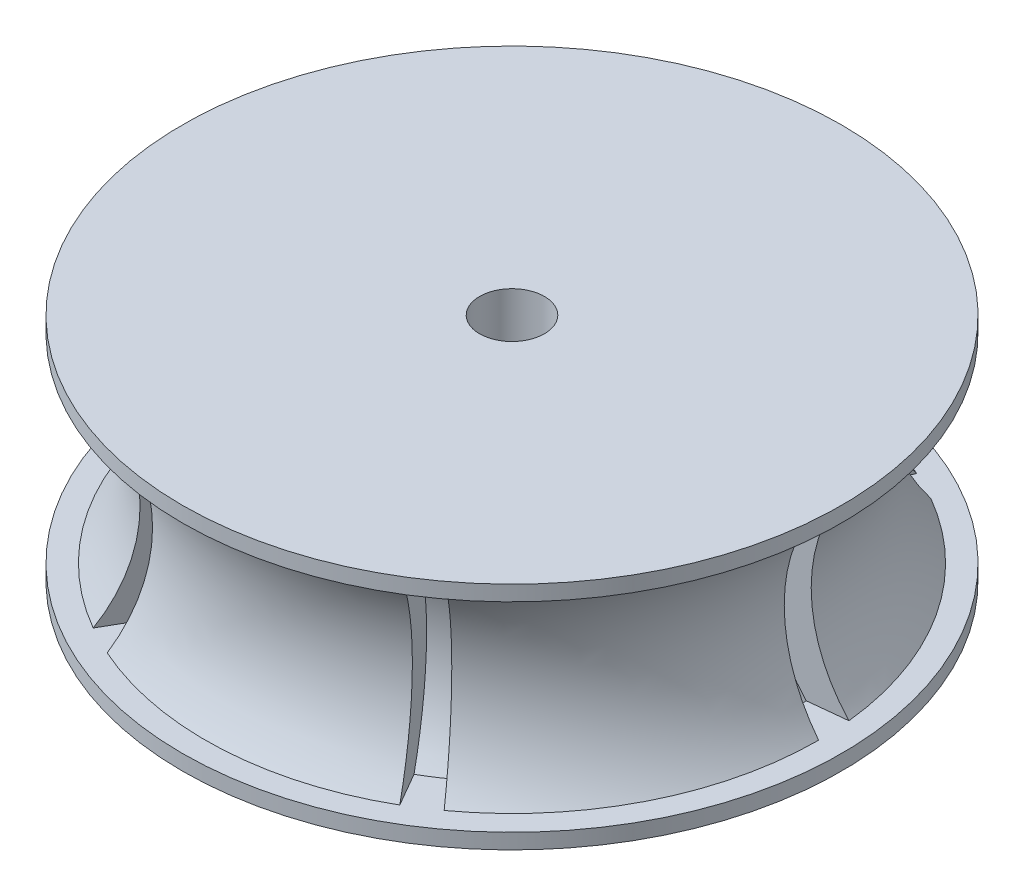
ISO-10303-21;
HEADER;
FILE_DESCRIPTION(('STEP AP214'),'2;1');
FILE_NAME('part.step','',(''),(''),'','','');
FILE_SCHEMA(('AUTOMOTIVE_DESIGN { 1 0 10303 214 1 1 1 1 }'));
ENDSEC;
DATA;
#1=APPLICATION_CONTEXT('core data for automotive mechanical design processes');
#2=APPLICATION_PROTOCOL_DEFINITION('international standard','automotive_design',2000,#1);
#3=PRODUCT_CONTEXT('',#1,'mechanical');
#4=PRODUCT('Part','Part','',(#3));
#5=PRODUCT_RELATED_PRODUCT_CATEGORY('part','',(#4));
#6=PRODUCT_DEFINITION_FORMATION('','',#4);
#7=PRODUCT_DEFINITION_CONTEXT('part definition',#1,'design');
#8=PRODUCT_DEFINITION('design','',#6,#7);
#9=PRODUCT_DEFINITION_SHAPE('','',#8);
#10=(LENGTH_UNIT() NAMED_UNIT(*) SI_UNIT(.MILLI.,.METRE.));
#11=(NAMED_UNIT(*) PLANE_ANGLE_UNIT() SI_UNIT($,.RADIAN.));
#12=(NAMED_UNIT(*) SI_UNIT($,.STERADIAN.) SOLID_ANGLE_UNIT());
#13=UNCERTAINTY_MEASURE_WITH_UNIT(LENGTH_MEASURE(1.E-05),#10,'distance_accuracy_value','');
#14=(GEOMETRIC_REPRESENTATION_CONTEXT(3) GLOBAL_UNCERTAINTY_ASSIGNED_CONTEXT((#13)) GLOBAL_UNIT_ASSIGNED_CONTEXT((#10,
#11,#12)) REPRESENTATION_CONTEXT('',''));
#15=CARTESIAN_POINT('',(0.,0.,0.));
#16=DIRECTION('',(0.,0.,1.));
#17=DIRECTION('',(1.,0.,0.));
#18=AXIS2_PLACEMENT_3D('',#15,#16,#17);
#19=CARTESIAN_POINT('',(0.,0.,0.));
#20=DIRECTION('',(0.,1.,0.));
#21=DIRECTION('',(0.,0.,1.));
#22=AXIS2_PLACEMENT_3D('',#19,#20,#21);
#23=TOROIDAL_SURFACE('',#22,85.09,31.75);
#24=CARTESIAN_POINT('',(0.,-19.55,0.));
#25=DIRECTION('',(0.,1.,0.));
#26=DIRECTION('',(0.,0.,1.));
#27=AXIS2_PLACEMENT_3D('',#24,#25,#26);
#28=CIRCLE('',#27,60.0728059127327);
#29=CARTESIAN_POINT('',(24.4338114170885,-19.55,-54.8792389694228));
#30=VERTEX_POINT('',#29);
#31=CARTESIAN_POINT('',(-30.036402956367,-19.55,-52.0245759970382));
#32=VERTEX_POINT('',#31);
#33=EDGE_CURVE('E447',#30,#32,#28,.T.);
#34=ORIENTED_EDGE('',*,*,#33,.T.);
#35=CARTESIAN_POINT('',(-42.5450000000009,0.,-73.6901016080174));
#36=DIRECTION('',(0.866025403784433,0.,-0.50000000000001));
#37=DIRECTION('',(0.50000000000001,0.,0.866025403784433));
#38=AXIS2_PLACEMENT_3D('',#35,#36,#37);
#39=CIRCLE('',#38,31.75);
#40=CARTESIAN_POINT('',(-30.036402956367,19.55,-52.0245759970382));
#41=VERTEX_POINT('',#40);
#42=EDGE_CURVE('E220',#41,#32,#39,.T.);
#43=ORIENTED_EDGE('',*,*,#42,.F.);
#44=CARTESIAN_POINT('',(0.,19.55,0.));
#45=DIRECTION('',(0.,1.,0.));
#46=DIRECTION('',(0.,0.,1.));
#47=AXIS2_PLACEMENT_3D('',#44,#45,#46);
#48=CIRCLE('',#47,60.0728059127327);
#49=CARTESIAN_POINT('',(24.4338114170885,19.55,-54.8792389694228));
#50=VERTEX_POINT('',#49);
#51=EDGE_CURVE('E394',#50,#41,#48,.T.);
#52=ORIENTED_EDGE('',*,*,#51,.F.);
#53=CARTESIAN_POINT('',(34.6092209593191,0.,-77.7335829908092));
#54=DIRECTION('',(0.913545457642605,0.,0.406736643075791));
#55=DIRECTION('',(-0.406736643075791,0.,0.913545457642605));
#56=AXIS2_PLACEMENT_3D('',#53,#54,#55);
#57=CIRCLE('',#56,31.75);
#58=EDGE_CURVE('E246',#50,#30,#57,.T.);
#59=ORIENTED_EDGE('',*,*,#58,.T.);
#60=EDGE_LOOP('',(#34,#43,#52,#59));
#61=FACE_BOUND('',#60,.T.);
#62=ADVANCED_FACE('F41',(#61),#23,.F.);
#63=CARTESIAN_POINT('',(59.7437207964214,-19.55,-6.27931808623397));
#64=VERTEX_POINT('',#63);
#65=CARTESIAN_POINT('',(30.0364029563659,-19.55,-52.0245759970389));
#66=VERTEX_POINT('',#65);
#67=EDGE_CURVE('E446',#64,#66,#28,.T.);
#68=ORIENTED_EDGE('',*,*,#67,.T.);
#69=CARTESIAN_POINT('',(42.5449999999993,0.,-73.6901016080183));
#70=DIRECTION('',(0.866025403784443,0.,0.499999999999992));
#71=DIRECTION('',(-0.499999999999992,0.,0.866025403784443));
#72=AXIS2_PLACEMENT_3D('',#69,#70,#71);
#73=CIRCLE('',#72,31.75);
#74=CARTESIAN_POINT('',(30.0364029563659,19.55,-52.0245759970389));
#75=VERTEX_POINT('',#74);
#76=EDGE_CURVE('E211',#75,#66,#73,.T.);
#77=ORIENTED_EDGE('',*,*,#76,.F.);
#78=CARTESIAN_POINT('',(59.7437207964214,19.55,-6.27931808623397));
#79=VERTEX_POINT('',#78);
#80=EDGE_CURVE('E399',#79,#75,#48,.T.);
#81=ORIENTED_EDGE('',*,*,#80,.F.);
#82=CARTESIAN_POINT('',(84.6238680768864,0.,-8.89432693944465));
#83=DIRECTION('',(0.104528463267654,0.,0.994521895368273));
#84=DIRECTION('',(-0.994521895368273,0.,0.104528463267654));
#85=AXIS2_PLACEMENT_3D('',#82,#83,#84);
#86=CIRCLE('',#85,31.75);
#87=EDGE_CURVE('E273',#79,#64,#86,.T.);
#88=ORIENTED_EDGE('',*,*,#87,.T.);
#89=EDGE_LOOP('',(#68,#77,#81,#88));
#90=FACE_BOUND('',#89,.T.);
#91=ADVANCED_FACE('F444',(#90),#23,.F.);
#92=CARTESIAN_POINT('',(35.3099093793326,-19.55,48.5999208831884));
#93=VERTEX_POINT('',#92);
#94=CARTESIAN_POINT('',(60.0728059127327,-19.55,0.));
#95=VERTEX_POINT('',#94);
#96=EDGE_CURVE('E432',#93,#95,#28,.T.);
#97=ORIENTED_EDGE('',*,*,#96,.T.);
#98=CARTESIAN_POINT('',(85.09,0.,0.));
#99=DIRECTION('',(0.,0.,1.));
#100=DIRECTION('',(-1.,0.,0.));
#101=AXIS2_PLACEMENT_3D('',#98,#99,#100);
#102=CIRCLE('',#101,31.75);
#103=CARTESIAN_POINT('',(60.0728059127327,19.55,0.));
#104=VERTEX_POINT('',#103);
#105=EDGE_CURVE('E262',#104,#95,#102,.T.);
#106=ORIENTED_EDGE('',*,*,#105,.F.);
#107=CARTESIAN_POINT('',(35.3099093793326,19.55,48.5999208831884));
#108=VERTEX_POINT('',#107);
#109=EDGE_CURVE('E402',#108,#104,#48,.T.);
#110=ORIENTED_EDGE('',*,*,#109,.F.);
#111=CARTESIAN_POINT('',(50.0146471175669,0.,68.8392560513641));
#112=DIRECTION('',(-0.809016994374945,0.,0.587785252292477));
#113=DIRECTION('',(-0.587785252292477,0.,-0.809016994374945));
#114=AXIS2_PLACEMENT_3D('',#111,#112,#113);
#115=CIRCLE('',#114,31.75);
#116=EDGE_CURVE('E300',#108,#93,#115,.T.);
#117=ORIENTED_EDGE('',*,*,#116,.T.);
#118=EDGE_LOOP('',(#97,#106,#110,#117));
#119=FACE_BOUND('',#118,.T.);
#120=ADVANCED_FACE('F430',(#119),#23,.F.);
#121=CARTESIAN_POINT('',(-24.4338114170889,-19.55,54.8792389694226));
#122=VERTEX_POINT('',#121);
#123=CARTESIAN_POINT('',(30.0364029563666,-19.55,52.0245759970384));
#124=VERTEX_POINT('',#123);
#125=EDGE_CURVE('E382',#122,#124,#28,.T.);
#126=ORIENTED_EDGE('',*,*,#125,.T.);
#127=CARTESIAN_POINT('',(42.5450000000003,0.,73.6901016080177));
#128=DIRECTION('',(-0.866025403784436,0.,0.500000000000004));
#129=DIRECTION('',(-0.500000000000004,0.,-0.866025403784436));
#130=AXIS2_PLACEMENT_3D('',#127,#128,#129);
#131=CIRCLE('',#130,31.75);
#132=CARTESIAN_POINT('',(30.0364029563666,19.55,52.0245759970384));
#133=VERTEX_POINT('',#132);
#134=EDGE_CURVE('E289',#133,#124,#131,.T.);
#135=ORIENTED_EDGE('',*,*,#134,.F.);
#136=CARTESIAN_POINT('',(-24.4338114170889,19.55,54.8792389694226));
#137=VERTEX_POINT('',#136);
#138=EDGE_CURVE('E49',#137,#133,#48,.T.);
#139=ORIENTED_EDGE('',*,*,#138,.F.);
#140=CARTESIAN_POINT('',(-34.6092209593197,0.,77.733582990809));
#141=DIRECTION('',(-0.913545457642602,0.,-0.406736643075798));
#142=DIRECTION('',(0.406736643075798,0.,-0.913545457642602));
#143=AXIS2_PLACEMENT_3D('',#140,#141,#142);
#144=CIRCLE('',#143,31.75);
#145=EDGE_CURVE('E327',#137,#122,#144,.T.);
#146=ORIENTED_EDGE('',*,*,#145,.T.);
#147=EDGE_LOOP('',(#126,#135,#139,#146));
#148=FACE_BOUND('',#147,.T.);
#149=ADVANCED_FACE('F417',(#148),#23,.F.);
#150=CARTESIAN_POINT('',(-59.7437207964214,-19.55,6.27931808623397));
#151=VERTEX_POINT('',#150);
#152=CARTESIAN_POINT('',(-30.0364029563663,-19.55,52.0245759970387));
#153=VERTEX_POINT('',#152);
#154=EDGE_CURVE('E378',#151,#153,#28,.T.);
#155=ORIENTED_EDGE('',*,*,#154,.T.);
#156=CARTESIAN_POINT('',(-42.5449999999998,0.,73.690101608018));
#157=DIRECTION('',(-0.86602540378444,0.,-0.499999999999998));
#158=DIRECTION('',(0.499999999999998,0.,-0.86602540378444));
#159=AXIS2_PLACEMENT_3D('',#156,#157,#158);
#160=CIRCLE('',#159,31.75);
#161=CARTESIAN_POINT('',(-30.0364029563662,19.55,52.0245759970386));
#162=VERTEX_POINT('',#161);
#163=EDGE_CURVE('E316',#162,#153,#160,.T.);
#164=ORIENTED_EDGE('',*,*,#163,.F.);
#165=CARTESIAN_POINT('',(-59.7437207964214,19.55,6.27931808623397));
#166=VERTEX_POINT('',#165);
#167=EDGE_CURVE('E11',#166,#162,#48,.T.);
#168=ORIENTED_EDGE('',*,*,#167,.F.);
#169=CARTESIAN_POINT('',(-84.6238680768864,0.,8.89432693944465));
#170=DIRECTION('',(-0.104528463267654,0.,-0.994521895368273));
#171=DIRECTION('',(0.994521895368273,0.,-0.104528463267654));
#172=AXIS2_PLACEMENT_3D('',#169,#170,#171);
#173=CIRCLE('',#172,31.75);
#174=EDGE_CURVE('E355',#166,#151,#173,.T.);
#175=ORIENTED_EDGE('',*,*,#174,.T.);
#176=EDGE_LOOP('',(#155,#164,#168,#175));
#177=FACE_BOUND('',#176,.T.);
#178=ADVANCED_FACE('F463',(#177),#23,.F.);
#179=CARTESIAN_POINT('',(-50.0146471175674,0.,-68.8392560513637));
#180=DIRECTION('',(0.80901699437494,0.,-0.587785252292483));
#181=DIRECTION('',(0.587785252292483,0.,0.80901699437494));
#182=AXIS2_PLACEMENT_3D('',#179,#180,#181);
#183=CIRCLE('',#182,31.75);
#184=CARTESIAN_POINT('',(-35.309909379333,19.55,-48.5999208831882));
#185=VERTEX_POINT('',#184);
#186=CARTESIAN_POINT('',(-35.309909379333,-19.55,-48.5999208831882));
#187=VERTEX_POINT('',#186);
#188=EDGE_CURVE('E226',#185,#187,#183,.T.);
#189=ORIENTED_EDGE('',*,*,#188,.T.);
#190=CARTESIAN_POINT('',(-60.0728059127327,-19.55,0.));
#191=VERTEX_POINT('',#190);
#192=EDGE_CURVE('E375',#187,#191,#28,.T.);
#193=ORIENTED_EDGE('',*,*,#192,.T.);
#194=CARTESIAN_POINT('',(-85.09,0.,0.));
#195=DIRECTION('',(0.,0.,-1.));
#196=DIRECTION('',(1.,0.,0.));
#197=AXIS2_PLACEMENT_3D('',#194,#195,#196);
#198=CIRCLE('',#197,31.75);
#199=CARTESIAN_POINT('',(-60.0728059127327,19.55,0.));
#200=VERTEX_POINT('',#199);
#201=EDGE_CURVE('E343',#200,#191,#198,.T.);
#202=ORIENTED_EDGE('',*,*,#201,.F.);
#203=EDGE_CURVE('E50',#185,#200,#48,.T.);
#204=ORIENTED_EDGE('',*,*,#203,.F.);
#205=EDGE_LOOP('',(#189,#193,#202,#204));
#206=FACE_BOUND('',#205,.T.);
#207=ADVANCED_FACE('F43',(#206),#23,.F.);
#208=CARTESIAN_POINT('',(0.,19.55,60.0728059127327));
#209=DIRECTION('',(0.,-1.,0.));
#210=DIRECTION('',(0.,0.,-1.));
#211=AXIS2_PLACEMENT_3D('',#208,#209,#210);
#212=PLANE('',#211);
#213=ORIENTED_EDGE('',*,*,#167,.T.);
#214=DIRECTION('',(-0.499999999999998,0.,0.86602540378444));
#215=VECTOR('',#214,1.);
#216=CARTESIAN_POINT('',(-30.0364029563662,19.55,52.0245759970386));
#217=LINE('',#216,#215);
#218=CARTESIAN_POINT('',(-26.2264029563663,19.55,45.4254624202012));
#219=VERTEX_POINT('',#218);
#220=EDGE_CURVE('E325',#219,#162,#217,.T.);
#221=ORIENTED_EDGE('',*,*,#220,.F.);
#222=CARTESIAN_POINT('',(0.,19.55,0.));
#223=DIRECTION('',(0.,-1.,0.));
#224=DIRECTION('',(-0.86602540378444,0.,-0.499999999999998));
#225=AXIS2_PLACEMENT_3D('',#222,#223,#224);
#226=CIRCLE('',#225,52.4528059127327);
#227=CARTESIAN_POINT('',(-21.3344781968513,19.55,47.918022582186));
#228=VERTEX_POINT('',#227);
#229=EDGE_CURVE('E339',#228,#219,#226,.T.);
#230=ORIENTED_EDGE('',*,*,#229,.F.);
#231=DIRECTION('',(-0.406736643075798,0.,0.913545457642602));
#232=VECTOR('',#231,1.);
#233=CARTESIAN_POINT('',(-24.4338114170889,19.55,54.8792389694226));
#234=LINE('',#233,#232);
#235=EDGE_CURVE('E336',#228,#137,#234,.T.);
#236=ORIENTED_EDGE('',*,*,#235,.T.);
#237=ORIENTED_EDGE('',*,*,#138,.T.);
#238=DIRECTION('',(0.500000000000004,0.,0.866025403784436));
#239=VECTOR('',#238,1.);
#240=CARTESIAN_POINT('',(30.0364029563666,19.55,52.0245759970384));
#241=LINE('',#240,#239);
#242=CARTESIAN_POINT('',(26.2264029563666,19.55,45.4254624202011));
#243=VERTEX_POINT('',#242);
#244=EDGE_CURVE('E298',#243,#133,#241,.T.);
#245=ORIENTED_EDGE('',*,*,#244,.F.);
#246=CARTESIAN_POINT('',(0.,19.55,0.));
#247=DIRECTION('',(0.,-1.,0.));
#248=DIRECTION('',(-0.866025403784436,0.,0.500000000000004));
#249=AXIS2_PLACEMENT_3D('',#246,#247,#248);
#250=CIRCLE('',#249,52.4528059127327);
#251=CARTESIAN_POINT('',(30.830985756864,19.55,42.4352113860514));
#252=VERTEX_POINT('',#251);
#253=EDGE_CURVE('E312',#252,#243,#250,.T.);
#254=ORIENTED_EDGE('',*,*,#253,.F.);
#255=DIRECTION('',(0.587785252292477,0.,0.809016994374945));
#256=VECTOR('',#255,1.);
#257=CARTESIAN_POINT('',(35.3099093793326,19.55,48.5999208831884));
#258=LINE('',#257,#256);
#259=EDGE_CURVE('E309',#252,#108,#258,.T.);
#260=ORIENTED_EDGE('',*,*,#259,.T.);
#261=ORIENTED_EDGE('',*,*,#109,.T.);
#262=DIRECTION('',(1.,0.,0.));
#263=VECTOR('',#262,1.);
#264=CARTESIAN_POINT('',(60.0728059127327,19.55,0.));
#265=LINE('',#264,#263);
#266=CARTESIAN_POINT('',(52.4528059127327,19.55,0.));
#267=VERTEX_POINT('',#266);
#268=EDGE_CURVE('E271',#267,#104,#265,.T.);
#269=ORIENTED_EDGE('',*,*,#268,.F.);
#270=CARTESIAN_POINT('',(0.,19.55,0.));
#271=DIRECTION('',(0.,-1.,0.));
#272=DIRECTION('',(0.,0.,1.));
#273=AXIS2_PLACEMENT_3D('',#270,#271,#272);
#274=CIRCLE('',#273,52.4528059127327);
#275=CARTESIAN_POINT('',(52.1654639537151,19.55,-5.48281119613445));
#276=VERTEX_POINT('',#275);
#277=EDGE_CURVE('E285',#276,#267,#274,.T.);
#278=ORIENTED_EDGE('',*,*,#277,.F.);
#279=DIRECTION('',(0.994521895368273,0.,-0.104528463267654));
#280=VECTOR('',#279,1.);
#281=CARTESIAN_POINT('',(59.7437207964214,19.55,-6.27931808623397));
#282=LINE('',#281,#280);
#283=EDGE_CURVE('E282',#276,#79,#282,.T.);
#284=ORIENTED_EDGE('',*,*,#283,.T.);
#285=ORIENTED_EDGE('',*,*,#80,.T.);
#286=DIRECTION('',(0.499999999999992,0.,-0.866025403784443));
#287=VECTOR('',#286,1.);
#288=CARTESIAN_POINT('',(30.0364029563659,19.55,-52.0245759970389));
#289=LINE('',#288,#287);
#290=CARTESIAN_POINT('',(26.2264029563659,19.55,-45.4254624202014));
#291=VERTEX_POINT('',#290);
#292=EDGE_CURVE('E244',#291,#75,#289,.T.);
#293=ORIENTED_EDGE('',*,*,#292,.F.);
#294=CARTESIAN_POINT('',(0.,19.55,0.));
#295=DIRECTION('',(0.,-1.,0.));
#296=DIRECTION('',(0.866025403784443,0.,0.499999999999992));
#297=AXIS2_PLACEMENT_3D('',#294,#295,#296);
#298=CIRCLE('',#297,52.4528059127327);
#299=CARTESIAN_POINT('',(21.3344781968509,19.55,-47.9180225821862));
#300=VERTEX_POINT('',#299);
#301=EDGE_CURVE('E258',#300,#291,#298,.T.);
#302=ORIENTED_EDGE('',*,*,#301,.F.);
#303=DIRECTION('',(0.406736643075791,0.,-0.913545457642605));
#304=VECTOR('',#303,1.);
#305=CARTESIAN_POINT('',(24.4338114170885,19.55,-54.8792389694228));
#306=LINE('',#305,#304);
#307=EDGE_CURVE('E255',#300,#50,#306,.T.);
#308=ORIENTED_EDGE('',*,*,#307,.T.);
#309=ORIENTED_EDGE('',*,*,#51,.T.);
#310=DIRECTION('',(-0.50000000000001,0.,-0.866025403784433));
#311=VECTOR('',#310,1.);
#312=CARTESIAN_POINT('',(-30.036402956367,19.55,-52.0245759970382));
#313=LINE('',#312,#311);
#314=CARTESIAN_POINT('',(-26.2264029563669,19.55,-45.4254624202009));
#315=VERTEX_POINT('',#314);
#316=EDGE_CURVE('E224',#315,#41,#313,.T.);
#317=ORIENTED_EDGE('',*,*,#316,.F.);
#318=CARTESIAN_POINT('',(0.,19.55,0.));
#319=DIRECTION('',(0.,-1.,0.));
#320=DIRECTION('',(0.866025403784433,0.,-0.50000000000001));
#321=AXIS2_PLACEMENT_3D('',#318,#319,#320);
#322=CIRCLE('',#321,52.4528059127327);
#323=CARTESIAN_POINT('',(-30.8309857568642,19.55,-42.4352113860512));
#324=VERTEX_POINT('',#323);
#325=EDGE_CURVE('E212',#324,#315,#322,.T.);
#326=ORIENTED_EDGE('',*,*,#325,.F.);
#327=DIRECTION('',(-0.587785252292483,0.,-0.80901699437494));
#328=VECTOR('',#327,1.);
#329=CARTESIAN_POINT('',(-35.309909379333,19.55,-48.5999208831882));
#330=LINE('',#329,#328);
#331=EDGE_CURVE('E235',#324,#185,#330,.T.);
#332=ORIENTED_EDGE('',*,*,#331,.T.);
#333=ORIENTED_EDGE('',*,*,#203,.T.);
#334=DIRECTION('',(-1.,0.,0.));
#335=VECTOR('',#334,1.);
#336=CARTESIAN_POINT('',(-60.0728059127327,19.55,0.));
#337=LINE('',#336,#335);
#338=CARTESIAN_POINT('',(-52.4528059127327,19.55,0.));
#339=VERTEX_POINT('',#338);
#340=EDGE_CURVE('E352',#339,#200,#337,.T.);
#341=ORIENTED_EDGE('',*,*,#340,.F.);
#342=CARTESIAN_POINT('',(0.,19.55,0.));
#343=DIRECTION('',(0.,-1.,0.));
#344=DIRECTION('',(0.,0.,-1.));
#345=AXIS2_PLACEMENT_3D('',#342,#343,#344);
#346=CIRCLE('',#345,52.4528059127327);
#347=CARTESIAN_POINT('',(-52.1654639537151,19.55,5.48281119613445));
#348=VERTEX_POINT('',#347);
#349=EDGE_CURVE('E367',#348,#339,#346,.T.);
#350=ORIENTED_EDGE('',*,*,#349,.F.);
#351=DIRECTION('',(-0.994521895368273,0.,0.104528463267654));
#352=VECTOR('',#351,1.);
#353=CARTESIAN_POINT('',(-59.7437207964214,19.55,6.27931808623397));
#354=LINE('',#353,#352);
#355=EDGE_CURVE('E364',#348,#166,#354,.T.);
#356=ORIENTED_EDGE('',*,*,#355,.T.);
#357=EDGE_LOOP('',(#213,#221,#230,#236,#237,#245,#254,#260,#261,#269,#278,#284,#285,#293,#302,
#308,#309,#317,#326,#332,#333,#341,#350,#356));
#358=FACE_BOUND('',#357,.T.);
#359=CARTESIAN_POINT('',(0.,19.55,0.));
#360=DIRECTION('',(0.,1.,0.));
#361=DIRECTION('',(0.,0.,1.));
#362=AXIS2_PLACEMENT_3D('',#359,#360,#361);
#363=CIRCLE('',#362,64.5728059127327);
#364=CARTESIAN_POINT('',(0.,19.55,64.5728059127327));
#365=VERTEX_POINT('',#364);
#366=EDGE_CURVE('E390',#365,#365,#363,.T.);
#367=ORIENTED_EDGE('',*,*,#366,.F.);
#368=EDGE_LOOP('',(#367));
#369=FACE_BOUND('',#368,.T.);
#370=ADVANCED_FACE('F411',(#358,#369),#212,.T.);
#371=CARTESIAN_POINT('',(0.,22.55,0.));
#372=DIRECTION('',(0.,1.,0.));
#373=DIRECTION('',(0.,0.,1.));
#374=AXIS2_PLACEMENT_3D('',#371,#372,#373);
#375=CYLINDRICAL_SURFACE('',#374,64.5728059127327);
#376=ORIENTED_EDGE('',*,*,#366,.T.);
#377=EDGE_LOOP('',(#376));
#378=FACE_BOUND('',#377,.T.);
#379=CARTESIAN_POINT('',(0.,22.55,0.));
#380=DIRECTION('',(0.,1.,0.));
#381=DIRECTION('',(0.,0.,1.));
#382=AXIS2_PLACEMENT_3D('',#379,#380,#381);
#383=CIRCLE('',#382,64.5728059127327);
#384=CARTESIAN_POINT('',(0.,22.55,64.5728059127327));
#385=VERTEX_POINT('',#384);
#386=EDGE_CURVE('E388',#385,#385,#383,.T.);
#387=ORIENTED_EDGE('',*,*,#386,.F.);
#388=EDGE_LOOP('',(#387));
#389=FACE_BOUND('',#388,.T.);
#390=ADVANCED_FACE('F493',(#378,#389),#375,.T.);
#391=CARTESIAN_POINT('',(0.,22.55,64.5728059127327));
#392=DIRECTION('',(0.,1.,0.));
#393=DIRECTION('',(0.,0.,1.));
#394=AXIS2_PLACEMENT_3D('',#391,#392,#393);
#395=PLANE('',#394);
#396=CARTESIAN_POINT('',(0.,22.55,0.));
#397=DIRECTION('',(0.,1.,0.));
#398=DIRECTION('',(0.,0.,1.));
#399=AXIS2_PLACEMENT_3D('',#396,#397,#398);
#400=CIRCLE('',#399,6.35);
#401=CARTESIAN_POINT('',(0.,22.55,6.35));
#402=VERTEX_POINT('',#401);
#403=EDGE_CURVE('E371',#402,#402,#400,.T.);
#404=ORIENTED_EDGE('',*,*,#403,.F.);
#405=EDGE_LOOP('',(#404));
#406=FACE_BOUND('',#405,.T.);
#407=ORIENTED_EDGE('',*,*,#386,.T.);
#408=EDGE_LOOP('',(#407));
#409=FACE_BOUND('',#408,.T.);
#410=ADVANCED_FACE('F725',(#406,#409),#395,.T.);
#411=CARTESIAN_POINT('',(0.,-22.55,0.));
#412=DIRECTION('',(0.,-1.,0.));
#413=DIRECTION('',(0.,0.,-1.));
#414=AXIS2_PLACEMENT_3D('',#411,#412,#413);
#415=PLANE('',#414);
#416=CARTESIAN_POINT('',(0.,-22.55,0.));
#417=DIRECTION('',(0.,1.,0.));
#418=DIRECTION('',(0.,0.,1.));
#419=AXIS2_PLACEMENT_3D('',#416,#417,#418);
#420=CIRCLE('',#419,6.35);
#421=CARTESIAN_POINT('',(0.,-22.55,6.35));
#422=VERTEX_POINT('',#421);
#423=EDGE_CURVE('E372',#422,#422,#420,.T.);
#424=ORIENTED_EDGE('',*,*,#423,.T.);
#425=EDGE_LOOP('',(#424));
#426=FACE_BOUND('',#425,.T.);
#427=CARTESIAN_POINT('',(0.,-22.55,0.));
#428=DIRECTION('',(0.,1.,0.));
#429=DIRECTION('',(0.,0.,1.));
#430=AXIS2_PLACEMENT_3D('',#427,#428,#429);
#431=CIRCLE('',#430,64.5728059127327);
#432=CARTESIAN_POINT('',(0.,-22.55,64.5728059127327));
#433=VERTEX_POINT('',#432);
#434=EDGE_CURVE('E385',#433,#433,#431,.T.);
#435=ORIENTED_EDGE('',*,*,#434,.F.);
#436=EDGE_LOOP('',(#435));
#437=FACE_BOUND('',#436,.T.);
#438=ADVANCED_FACE('F721',(#426,#437),#415,.T.);
#439=CARTESIAN_POINT('',(0.,22.55,0.));
#440=DIRECTION('',(0.,1.,0.));
#441=DIRECTION('',(0.,0.,1.));
#442=AXIS2_PLACEMENT_3D('',#439,#440,#441);
#443=CYLINDRICAL_SURFACE('',#442,64.5728059127327);
#444=ORIENTED_EDGE('',*,*,#434,.T.);
#445=EDGE_LOOP('',(#444));
#446=FACE_BOUND('',#445,.T.);
#447=CARTESIAN_POINT('',(0.,-19.55,0.));
#448=DIRECTION('',(0.,1.,0.));
#449=DIRECTION('',(0.,0.,1.));
#450=AXIS2_PLACEMENT_3D('',#447,#448,#449);
#451=CIRCLE('',#450,64.5728059127327);
#452=CARTESIAN_POINT('',(0.,-19.55,64.5728059127327));
#453=VERTEX_POINT('',#452);
#454=EDGE_CURVE('E381',#453,#453,#451,.T.);
#455=ORIENTED_EDGE('',*,*,#454,.F.);
#456=EDGE_LOOP('',(#455));
#457=FACE_BOUND('',#456,.T.);
#458=ADVANCED_FACE('F643',(#446,#457),#443,.T.);
#459=CARTESIAN_POINT('',(0.,-19.55,64.5728059127327));
#460=DIRECTION('',(0.,1.,0.));
#461=DIRECTION('',(0.,0.,1.));
#462=AXIS2_PLACEMENT_3D('',#459,#460,#461);
#463=PLANE('',#462);
#464=ORIENTED_EDGE('',*,*,#454,.T.);
#465=EDGE_LOOP('',(#464));
#466=FACE_BOUND('',#465,.T.);
#467=ORIENTED_EDGE('',*,*,#154,.F.);
#468=DIRECTION('',(0.994521895368273,0.,-0.104528463267654));
#469=VECTOR('',#468,1.);
#470=CARTESIAN_POINT('',(-59.7437207964214,-19.55,6.27931808623397));
#471=LINE('',#470,#469);
#472=CARTESIAN_POINT('',(-52.1654639537151,-19.55,5.48281119613445));
#473=VERTEX_POINT('',#472);
#474=EDGE_CURVE('E358',#151,#473,#471,.T.);
#475=ORIENTED_EDGE('',*,*,#474,.T.);
#476=CARTESIAN_POINT('',(0.,-19.55,0.));
#477=DIRECTION('',(0.,-1.,0.));
#478=DIRECTION('',(0.,0.,-1.));
#479=AXIS2_PLACEMENT_3D('',#476,#477,#478);
#480=CIRCLE('',#479,52.4528059127327);
#481=CARTESIAN_POINT('',(-52.4528059127327,-19.55,0.));
#482=VERTEX_POINT('',#481);
#483=EDGE_CURVE('E369',#473,#482,#480,.T.);
#484=ORIENTED_EDGE('',*,*,#483,.T.);
#485=DIRECTION('',(1.,0.,0.));
#486=VECTOR('',#485,1.);
#487=CARTESIAN_POINT('',(-60.0728059127327,-19.55,0.));
#488=LINE('',#487,#486);
#489=EDGE_CURVE('E346',#191,#482,#488,.T.);
#490=ORIENTED_EDGE('',*,*,#489,.F.);
#491=ORIENTED_EDGE('',*,*,#192,.F.);
#492=DIRECTION('',(0.587785252292483,0.,0.80901699437494));
#493=VECTOR('',#492,1.);
#494=CARTESIAN_POINT('',(-35.309909379333,-19.55,-48.5999208831882));
#495=LINE('',#494,#493);
#496=CARTESIAN_POINT('',(-30.8309857568642,-19.55,-42.4352113860512));
#497=VERTEX_POINT('',#496);
#498=EDGE_CURVE('E206',#187,#497,#495,.T.);
#499=ORIENTED_EDGE('',*,*,#498,.T.);
#500=CARTESIAN_POINT('',(0.,-19.55,0.));
#501=DIRECTION('',(0.,-1.,0.));
#502=DIRECTION('',(0.866025403784433,0.,-0.50000000000001));
#503=AXIS2_PLACEMENT_3D('',#500,#501,#502);
#504=CIRCLE('',#503,52.4528059127327);
#505=CARTESIAN_POINT('',(-26.2264029563669,-19.55,-45.4254624202009));
#506=VERTEX_POINT('',#505);
#507=EDGE_CURVE('E202',#497,#506,#504,.T.);
#508=ORIENTED_EDGE('',*,*,#507,.T.);
#509=DIRECTION('',(0.50000000000001,0.,0.866025403784433));
#510=VECTOR('',#509,1.);
#511=CARTESIAN_POINT('',(-30.036402956367,-19.55,-52.0245759970382));
#512=LINE('',#511,#510);
#513=EDGE_CURVE('E57',#32,#506,#512,.T.);
#514=ORIENTED_EDGE('',*,*,#513,.F.);
#515=ORIENTED_EDGE('',*,*,#33,.F.);
#516=DIRECTION('',(-0.406736643075791,0.,0.913545457642605));
#517=VECTOR('',#516,1.);
#518=CARTESIAN_POINT('',(24.4338114170885,-19.55,-54.8792389694228));
#519=LINE('',#518,#517);
#520=CARTESIAN_POINT('',(21.3344781968509,-19.55,-47.9180225821862));
#521=VERTEX_POINT('',#520);
#522=EDGE_CURVE('E249',#30,#521,#519,.T.);
#523=ORIENTED_EDGE('',*,*,#522,.T.);
#524=CARTESIAN_POINT('',(0.,-19.55,0.));
#525=DIRECTION('',(0.,-1.,0.));
#526=DIRECTION('',(0.866025403784443,0.,0.499999999999992));
#527=AXIS2_PLACEMENT_3D('',#524,#525,#526);
#528=CIRCLE('',#527,52.4528059127327);
#529=CARTESIAN_POINT('',(26.2264029563659,-19.55,-45.4254624202014));
#530=VERTEX_POINT('',#529);
#531=EDGE_CURVE('E260',#521,#530,#528,.T.);
#532=ORIENTED_EDGE('',*,*,#531,.T.);
#533=DIRECTION('',(-0.499999999999992,0.,0.866025403784443));
#534=VECTOR('',#533,1.);
#535=CARTESIAN_POINT('',(30.0364029563659,-19.55,-52.0245759970388));
#536=LINE('',#535,#534);
#537=EDGE_CURVE('E64',#66,#530,#536,.T.);
#538=ORIENTED_EDGE('',*,*,#537,.F.);
#539=ORIENTED_EDGE('',*,*,#67,.F.);
#540=DIRECTION('',(-0.994521895368273,0.,0.104528463267654));
#541=VECTOR('',#540,1.);
#542=CARTESIAN_POINT('',(59.7437207964214,-19.55,-6.27931808623397));
#543=LINE('',#542,#541);
#544=CARTESIAN_POINT('',(52.1654639537151,-19.55,-5.48281119613445));
#545=VERTEX_POINT('',#544);
#546=EDGE_CURVE('E276',#64,#545,#543,.T.);
#547=ORIENTED_EDGE('',*,*,#546,.T.);
#548=CARTESIAN_POINT('',(0.,-19.55,0.));
#549=DIRECTION('',(0.,-1.,0.));
#550=DIRECTION('',(0.,0.,1.));
#551=AXIS2_PLACEMENT_3D('',#548,#549,#550);
#552=CIRCLE('',#551,52.4528059127327);
#553=CARTESIAN_POINT('',(52.4528059127327,-19.55,0.));
#554=VERTEX_POINT('',#553);
#555=EDGE_CURVE('E287',#545,#554,#552,.T.);
#556=ORIENTED_EDGE('',*,*,#555,.T.);
#557=DIRECTION('',(-1.,0.,0.));
#558=VECTOR('',#557,1.);
#559=CARTESIAN_POINT('',(60.0728059127327,-19.55,0.));
#560=LINE('',#559,#558);
#561=EDGE_CURVE('E265',#95,#554,#560,.T.);
#562=ORIENTED_EDGE('',*,*,#561,.F.);
#563=ORIENTED_EDGE('',*,*,#96,.F.);
#564=DIRECTION('',(-0.587785252292477,0.,-0.809016994374945));
#565=VECTOR('',#564,1.);
#566=CARTESIAN_POINT('',(35.3099093793326,-19.55,48.5999208831884));
#567=LINE('',#566,#565);
#568=CARTESIAN_POINT('',(30.830985756864,-19.55,42.4352113860514));
#569=VERTEX_POINT('',#568);
#570=EDGE_CURVE('E303',#93,#569,#567,.T.);
#571=ORIENTED_EDGE('',*,*,#570,.T.);
#572=CARTESIAN_POINT('',(0.,-19.55,0.));
#573=DIRECTION('',(0.,-1.,0.));
#574=DIRECTION('',(-0.866025403784436,0.,0.500000000000004));
#575=AXIS2_PLACEMENT_3D('',#572,#573,#574);
#576=CIRCLE('',#575,52.4528059127327);
#577=CARTESIAN_POINT('',(26.2264029563666,-19.55,45.4254624202011));
#578=VERTEX_POINT('',#577);
#579=EDGE_CURVE('E314',#569,#578,#576,.T.);
#580=ORIENTED_EDGE('',*,*,#579,.T.);
#581=DIRECTION('',(-0.500000000000004,0.,-0.866025403784436));
#582=VECTOR('',#581,1.);
#583=CARTESIAN_POINT('',(30.0364029563666,-19.55,52.0245759970384));
#584=LINE('',#583,#582);
#585=EDGE_CURVE('E292',#124,#578,#584,.T.);
#586=ORIENTED_EDGE('',*,*,#585,.F.);
#587=ORIENTED_EDGE('',*,*,#125,.F.);
#588=DIRECTION('',(0.406736643075798,0.,-0.913545457642602));
#589=VECTOR('',#588,1.);
#590=CARTESIAN_POINT('',(-24.4338114170889,-19.55,54.8792389694226));
#591=LINE('',#590,#589);
#592=CARTESIAN_POINT('',(-21.3344781968513,-19.55,47.918022582186));
#593=VERTEX_POINT('',#592);
#594=EDGE_CURVE('E330',#122,#593,#591,.T.);
#595=ORIENTED_EDGE('',*,*,#594,.T.);
#596=CARTESIAN_POINT('',(0.,-19.55,0.));
#597=DIRECTION('',(0.,-1.,0.));
#598=DIRECTION('',(-0.86602540378444,0.,-0.499999999999998));
#599=AXIS2_PLACEMENT_3D('',#596,#597,#598);
#600=CIRCLE('',#599,52.4528059127327);
#601=CARTESIAN_POINT('',(-26.2264029563663,-19.55,45.4254624202012));
#602=VERTEX_POINT('',#601);
#603=EDGE_CURVE('E341',#593,#602,#600,.T.);
#604=ORIENTED_EDGE('',*,*,#603,.T.);
#605=DIRECTION('',(0.499999999999998,0.,-0.86602540378444));
#606=VECTOR('',#605,1.);
#607=CARTESIAN_POINT('',(-30.0364029563662,-19.55,52.0245759970386));
#608=LINE('',#607,#606);
#609=EDGE_CURVE('E319',#153,#602,#608,.T.);
#610=ORIENTED_EDGE('',*,*,#609,.F.);
#611=EDGE_LOOP('',(#467,#475,#484,#490,#491,#499,#508,#514,#515,#523,#532,#538,#539,#547,#556,
#562,#563,#571,#580,#586,#587,#595,#604,#610));
#612=FACE_BOUND('',#611,.T.);
#613=ADVANCED_FACE('F204',(#466,#612),#463,.T.);
#614=CARTESIAN_POINT('',(0.,-22.55,0.));
#615=DIRECTION('',(0.,1.,0.));
#616=DIRECTION('',(0.,0.,1.));
#617=AXIS2_PLACEMENT_3D('',#614,#615,#616);
#618=CYLINDRICAL_SURFACE('',#617,6.35);
#619=ORIENTED_EDGE('',*,*,#423,.F.);
#620=EDGE_LOOP('',(#619));
#621=FACE_BOUND('',#620,.T.);
#622=ORIENTED_EDGE('',*,*,#403,.T.);
#623=EDGE_LOOP('',(#622));
#624=FACE_BOUND('',#623,.T.);
#625=ADVANCED_FACE('F642',(#621,#624),#618,.F.);
#626=CARTESIAN_POINT('',(0.,0.,0.));
#627=DIRECTION('',(0.,-1.,0.));
#628=DIRECTION('',(0.,0.,-1.));
#629=AXIS2_PLACEMENT_3D('',#626,#627,#628);
#630=TOROIDAL_SURFACE('',#629,77.47,31.75);
#631=ORIENTED_EDGE('',*,*,#349,.T.);
#632=CARTESIAN_POINT('',(-77.47,0.,0.));
#633=DIRECTION('',(0.,0.,1.));
#634=DIRECTION('',(-1.,0.,0.));
#635=AXIS2_PLACEMENT_3D('',#632,#633,#634);
#636=CIRCLE('',#635,31.75);
#637=EDGE_CURVE('E349',#482,#339,#636,.T.);
#638=ORIENTED_EDGE('',*,*,#637,.F.);
#639=ORIENTED_EDGE('',*,*,#483,.F.);
#640=CARTESIAN_POINT('',(-77.0456112341801,0.,8.09782004934513));
#641=DIRECTION('',(0.104528463267654,0.,0.994521895368273));
#642=DIRECTION('',(-0.994521895368273,0.,0.104528463267654));
#643=AXIS2_PLACEMENT_3D('',#640,#641,#642);
#644=CIRCLE('',#643,31.75);
#645=EDGE_CURVE('E361',#473,#348,#644,.T.);
#646=ORIENTED_EDGE('',*,*,#645,.T.);
#647=EDGE_LOOP('',(#631,#638,#639,#646));
#648=FACE_BOUND('',#647,.T.);
#649=ADVANCED_FACE('F459',(#648),#630,.F.);
#650=CARTESIAN_POINT('',(-84.6238680768864,0.,8.89432693944465));
#651=DIRECTION('',(0.104528463267654,0.,0.994521895368273));
#652=DIRECTION('',(0.994521895368273,0.,-0.104528463267654));
#653=AXIS2_PLACEMENT_3D('',#650,#651,#652);
#654=PLANE('',#653);
#655=ORIENTED_EDGE('',*,*,#174,.F.);
#656=ORIENTED_EDGE('',*,*,#355,.F.);
#657=ORIENTED_EDGE('',*,*,#645,.F.);
#658=ORIENTED_EDGE('',*,*,#474,.F.);
#659=EDGE_LOOP('',(#655,#656,#657,#658));
#660=FACE_BOUND('',#659,.T.);
#661=ADVANCED_FACE('F461',(#660),#654,.F.);
#662=CARTESIAN_POINT('',(-85.09,0.,0.));
#663=DIRECTION('',(0.,0.,1.));
#664=DIRECTION('',(1.,0.,0.));
#665=AXIS2_PLACEMENT_3D('',#662,#663,#664);
#666=PLANE('',#665);
#667=ORIENTED_EDGE('',*,*,#201,.T.);
#668=ORIENTED_EDGE('',*,*,#489,.T.);
#669=ORIENTED_EDGE('',*,*,#637,.T.);
#670=ORIENTED_EDGE('',*,*,#340,.T.);
#671=EDGE_LOOP('',(#667,#668,#669,#670));
#672=FACE_BOUND('',#671,.T.);
#673=ADVANCED_FACE('F454',(#672),#666,.T.);
#674=CARTESIAN_POINT('',(0.,0.,0.));
#675=DIRECTION('',(0.,-1.,0.));
#676=DIRECTION('',(-0.86602540378444,0.,-0.499999999999998));
#677=AXIS2_PLACEMENT_3D('',#674,#675,#676);
#678=TOROIDAL_SURFACE('',#677,77.47,31.75);
#679=ORIENTED_EDGE('',*,*,#229,.T.);
#680=CARTESIAN_POINT('',(-38.7349999999998,0.,67.0909880311805));
#681=DIRECTION('',(0.86602540378444,0.,0.499999999999998));
#682=DIRECTION('',(-0.499999999999998,0.,0.86602540378444));
#683=AXIS2_PLACEMENT_3D('',#680,#681,#682);
#684=CIRCLE('',#683,31.75);
#685=EDGE_CURVE('E322',#602,#219,#684,.T.);
#686=ORIENTED_EDGE('',*,*,#685,.F.);
#687=ORIENTED_EDGE('',*,*,#603,.F.);
#688=CARTESIAN_POINT('',(-31.5098877390821,0.,70.7723666035724));
#689=DIRECTION('',(0.913545457642602,0.,0.406736643075798));
#690=DIRECTION('',(-0.406736643075798,0.,0.913545457642602));
#691=AXIS2_PLACEMENT_3D('',#688,#689,#690);
#692=CIRCLE('',#691,31.75);
#693=EDGE_CURVE('E333',#593,#228,#692,.T.);
#694=ORIENTED_EDGE('',*,*,#693,.T.);
#695=EDGE_LOOP('',(#679,#686,#687,#694));
#696=FACE_BOUND('',#695,.T.);
#697=ADVANCED_FACE('F471',(#696),#678,.F.);
#698=CARTESIAN_POINT('',(-34.6092209593197,0.,77.733582990809));
#699=DIRECTION('',(0.913545457642602,0.,0.406736643075798));
#700=DIRECTION('',(0.406736643075798,0.,-0.913545457642602));
#701=AXIS2_PLACEMENT_3D('',#698,#699,#700);
#702=PLANE('',#701);
#703=ORIENTED_EDGE('',*,*,#145,.F.);
#704=ORIENTED_EDGE('',*,*,#235,.F.);
#705=ORIENTED_EDGE('',*,*,#693,.F.);
#706=ORIENTED_EDGE('',*,*,#594,.F.);
#707=EDGE_LOOP('',(#703,#704,#705,#706));
#708=FACE_BOUND('',#707,.T.);
#709=ADVANCED_FACE('F473',(#708),#702,.F.);
#710=CARTESIAN_POINT('',(-42.5449999999998,0.,73.690101608018));
#711=DIRECTION('',(0.86602540378444,0.,0.499999999999998));
#712=DIRECTION('',(0.499999999999998,0.,-0.86602540378444));
#713=AXIS2_PLACEMENT_3D('',#710,#711,#712);
#714=PLANE('',#713);
#715=ORIENTED_EDGE('',*,*,#163,.T.);
#716=ORIENTED_EDGE('',*,*,#609,.T.);
#717=ORIENTED_EDGE('',*,*,#685,.T.);
#718=ORIENTED_EDGE('',*,*,#220,.T.);
#719=EDGE_LOOP('',(#715,#716,#717,#718));
#720=FACE_BOUND('',#719,.T.);
#721=ADVANCED_FACE('F467',(#720),#714,.T.);
#722=CARTESIAN_POINT('',(0.,0.,0.));
#723=DIRECTION('',(0.,-1.,0.));
#724=DIRECTION('',(-0.866025403784436,0.,0.500000000000004));
#725=AXIS2_PLACEMENT_3D('',#722,#723,#724);
#726=TOROIDAL_SURFACE('',#725,77.47,31.75);
#727=ORIENTED_EDGE('',*,*,#253,.T.);
#728=CARTESIAN_POINT('',(38.7350000000003,0.,67.0909880311803));
#729=DIRECTION('',(0.866025403784436,0.,-0.500000000000004));
#730=DIRECTION('',(0.500000000000004,0.,0.866025403784436));
#731=AXIS2_PLACEMENT_3D('',#728,#729,#730);
#732=CIRCLE('',#731,31.75);
#733=EDGE_CURVE('E295',#578,#243,#732,.T.);
#734=ORIENTED_EDGE('',*,*,#733,.F.);
#735=ORIENTED_EDGE('',*,*,#579,.F.);
#736=CARTESIAN_POINT('',(45.5357234950982,0.,62.674546554227));
#737=DIRECTION('',(0.809016994374945,0.,-0.587785252292477));
#738=DIRECTION('',(0.587785252292477,0.,0.809016994374945));
#739=AXIS2_PLACEMENT_3D('',#736,#737,#738);
#740=CIRCLE('',#739,31.75);
#741=EDGE_CURVE('E306',#569,#252,#740,.T.);
#742=ORIENTED_EDGE('',*,*,#741,.T.);
#743=EDGE_LOOP('',(#727,#734,#735,#742));
#744=FACE_BOUND('',#743,.T.);
#745=ADVANCED_FACE('F423',(#744),#726,.F.);
#746=CARTESIAN_POINT('',(50.0146471175669,0.,68.8392560513641));
#747=DIRECTION('',(0.809016994374945,0.,-0.587785252292477));
#748=DIRECTION('',(-0.587785252292477,0.,-0.809016994374945));
#749=AXIS2_PLACEMENT_3D('',#746,#747,#748);
#750=PLANE('',#749);
#751=ORIENTED_EDGE('',*,*,#116,.F.);
#752=ORIENTED_EDGE('',*,*,#259,.F.);
#753=ORIENTED_EDGE('',*,*,#741,.F.);
#754=ORIENTED_EDGE('',*,*,#570,.F.);
#755=EDGE_LOOP('',(#751,#752,#753,#754));
#756=FACE_BOUND('',#755,.T.);
#757=ADVANCED_FACE('F474',(#756),#750,.F.);
#758=CARTESIAN_POINT('',(42.5450000000003,0.,73.6901016080177));
#759=DIRECTION('',(0.866025403784436,0.,-0.500000000000004));
#760=DIRECTION('',(-0.500000000000004,0.,-0.866025403784436));
#761=AXIS2_PLACEMENT_3D('',#758,#759,#760);
#762=PLANE('',#761);
#763=ORIENTED_EDGE('',*,*,#134,.T.);
#764=ORIENTED_EDGE('',*,*,#585,.T.);
#765=ORIENTED_EDGE('',*,*,#733,.T.);
#766=ORIENTED_EDGE('',*,*,#244,.T.);
#767=EDGE_LOOP('',(#763,#764,#765,#766));
#768=FACE_BOUND('',#767,.T.);
#769=ADVANCED_FACE('F420',(#768),#762,.T.);
#770=CARTESIAN_POINT('',(0.,0.,0.));
#771=DIRECTION('',(0.,-1.,0.));
#772=DIRECTION('',(0.,0.,1.));
#773=AXIS2_PLACEMENT_3D('',#770,#771,#772);
#774=TOROIDAL_SURFACE('',#773,77.47,31.75);
#775=ORIENTED_EDGE('',*,*,#277,.T.);
#776=CARTESIAN_POINT('',(77.47,0.,0.));
#777=DIRECTION('',(0.,0.,-1.));
#778=DIRECTION('',(1.,0.,0.));
#779=AXIS2_PLACEMENT_3D('',#776,#777,#778);
#780=CIRCLE('',#779,31.75);
#781=EDGE_CURVE('E268',#554,#267,#780,.T.);
#782=ORIENTED_EDGE('',*,*,#781,.F.);
#783=ORIENTED_EDGE('',*,*,#555,.F.);
#784=CARTESIAN_POINT('',(77.0456112341801,0.,-8.09782004934513));
#785=DIRECTION('',(-0.104528463267654,0.,-0.994521895368273));
#786=DIRECTION('',(0.994521895368273,0.,-0.104528463267654));
#787=AXIS2_PLACEMENT_3D('',#784,#785,#786);
#788=CIRCLE('',#787,31.75);
#789=EDGE_CURVE('E279',#545,#276,#788,.T.);
#790=ORIENTED_EDGE('',*,*,#789,.T.);
#791=EDGE_LOOP('',(#775,#782,#783,#790));
#792=FACE_BOUND('',#791,.T.);
#793=ADVANCED_FACE('F439',(#792),#774,.F.);
#794=CARTESIAN_POINT('',(84.6238680768864,0.,-8.89432693944465));
#795=DIRECTION('',(-0.104528463267654,0.,-0.994521895368273));
#796=DIRECTION('',(-0.994521895368273,0.,0.104528463267654));
#797=AXIS2_PLACEMENT_3D('',#794,#795,#796);
#798=PLANE('',#797);
#799=ORIENTED_EDGE('',*,*,#87,.F.);
#800=ORIENTED_EDGE('',*,*,#283,.F.);
#801=ORIENTED_EDGE('',*,*,#789,.F.);
#802=ORIENTED_EDGE('',*,*,#546,.F.);
#803=EDGE_LOOP('',(#799,#800,#801,#802));
#804=FACE_BOUND('',#803,.T.);
#805=ADVANCED_FACE('F441',(#804),#798,.F.);
#806=CARTESIAN_POINT('',(85.09,0.,0.));
#807=DIRECTION('',(0.,0.,-1.));
#808=DIRECTION('',(-1.,0.,0.));
#809=AXIS2_PLACEMENT_3D('',#806,#807,#808);
#810=PLANE('',#809);
#811=ORIENTED_EDGE('',*,*,#105,.T.);
#812=ORIENTED_EDGE('',*,*,#561,.T.);
#813=ORIENTED_EDGE('',*,*,#781,.T.);
#814=ORIENTED_EDGE('',*,*,#268,.T.);
#815=EDGE_LOOP('',(#811,#812,#813,#814));
#816=FACE_BOUND('',#815,.T.);
#817=ADVANCED_FACE('F434',(#816),#810,.T.);
#818=CARTESIAN_POINT('',(0.,0.,0.));
#819=DIRECTION('',(0.,-1.,0.));
#820=DIRECTION('',(0.866025403784443,0.,0.499999999999992));
#821=AXIS2_PLACEMENT_3D('',#818,#819,#820);
#822=TOROIDAL_SURFACE('',#821,77.47,31.75);
#823=ORIENTED_EDGE('',*,*,#301,.T.);
#824=CARTESIAN_POINT('',(38.7349999999994,0.,-67.0909880311808));
#825=DIRECTION('',(-0.866025403784443,0.,-0.499999999999992));
#826=DIRECTION('',(0.499999999999992,0.,-0.866025403784443));
#827=AXIS2_PLACEMENT_3D('',#824,#825,#826);
#828=CIRCLE('',#827,31.75);
#829=EDGE_CURVE('E241',#530,#291,#828,.T.);
#830=ORIENTED_EDGE('',*,*,#829,.F.);
#831=ORIENTED_EDGE('',*,*,#531,.F.);
#832=CARTESIAN_POINT('',(31.5098877390816,0.,-70.7723666035726));
#833=DIRECTION('',(-0.913545457642605,0.,-0.406736643075791));
#834=DIRECTION('',(0.406736643075791,0.,-0.913545457642605));
#835=AXIS2_PLACEMENT_3D('',#832,#833,#834);
#836=CIRCLE('',#835,31.75);
#837=EDGE_CURVE('E252',#521,#300,#836,.T.);
#838=ORIENTED_EDGE('',*,*,#837,.T.);
#839=EDGE_LOOP('',(#823,#830,#831,#838));
#840=FACE_BOUND('',#839,.T.);
#841=ADVANCED_FACE('F570',(#840),#822,.F.);
#842=CARTESIAN_POINT('',(34.6092209593191,0.,-77.7335829908092));
#843=DIRECTION('',(-0.913545457642605,0.,-0.406736643075791));
#844=DIRECTION('',(-0.406736643075791,0.,0.913545457642605));
#845=AXIS2_PLACEMENT_3D('',#842,#843,#844);
#846=PLANE('',#845);
#847=ORIENTED_EDGE('',*,*,#58,.F.);
#848=ORIENTED_EDGE('',*,*,#307,.F.);
#849=ORIENTED_EDGE('',*,*,#837,.F.);
#850=ORIENTED_EDGE('',*,*,#522,.F.);
#851=EDGE_LOOP('',(#847,#848,#849,#850));
#852=FACE_BOUND('',#851,.T.);
#853=ADVANCED_FACE('F578',(#852),#846,.F.);
#854=CARTESIAN_POINT('',(42.5449999999993,0.,-73.6901016080183));
#855=DIRECTION('',(-0.866025403784443,0.,-0.499999999999992));
#856=DIRECTION('',(-0.499999999999992,0.,0.866025403784443));
#857=AXIS2_PLACEMENT_3D('',#854,#855,#856);
#858=PLANE('',#857);
#859=ORIENTED_EDGE('',*,*,#76,.T.);
#860=ORIENTED_EDGE('',*,*,#537,.T.);
#861=ORIENTED_EDGE('',*,*,#829,.T.);
#862=ORIENTED_EDGE('',*,*,#292,.T.);
#863=EDGE_LOOP('',(#859,#860,#861,#862));
#864=FACE_BOUND('',#863,.T.);
#865=ADVANCED_FACE('F587',(#864),#858,.T.);
#866=CARTESIAN_POINT('',(0.,0.,0.));
#867=DIRECTION('',(0.,-1.,0.));
#868=DIRECTION('',(0.866025403784433,0.,-0.50000000000001));
#869=AXIS2_PLACEMENT_3D('',#866,#867,#868);
#870=TOROIDAL_SURFACE('',#869,77.47,31.75);
#871=ORIENTED_EDGE('',*,*,#325,.T.);
#872=CARTESIAN_POINT('',(-38.7350000000008,0.,-67.09098803118));
#873=DIRECTION('',(-0.866025403784433,0.,0.50000000000001));
#874=DIRECTION('',(-0.50000000000001,0.,-0.866025403784433));
#875=AXIS2_PLACEMENT_3D('',#872,#873,#874);
#876=CIRCLE('',#875,31.75);
#877=EDGE_CURVE('E217',#506,#315,#876,.T.);
#878=ORIENTED_EDGE('',*,*,#877,.F.);
#879=ORIENTED_EDGE('',*,*,#507,.F.);
#880=CARTESIAN_POINT('',(-45.5357234950986,0.,-62.6745465542267));
#881=DIRECTION('',(-0.80901699437494,0.,0.587785252292483));
#882=DIRECTION('',(-0.587785252292483,0.,-0.80901699437494));
#883=AXIS2_PLACEMENT_3D('',#880,#881,#882);
#884=CIRCLE('',#883,31.75);
#885=EDGE_CURVE('E233',#497,#324,#884,.T.);
#886=ORIENTED_EDGE('',*,*,#885,.T.);
#887=EDGE_LOOP('',(#871,#878,#879,#886));
#888=FACE_BOUND('',#887,.T.);
#889=ADVANCED_FACE('F223',(#888),#870,.F.);
#890=CARTESIAN_POINT('',(-50.0146471175674,0.,-68.8392560513637));
#891=DIRECTION('',(-0.80901699437494,0.,0.587785252292483));
#892=DIRECTION('',(0.587785252292483,0.,0.80901699437494));
#893=AXIS2_PLACEMENT_3D('',#890,#891,#892);
#894=PLANE('',#893);
#895=ORIENTED_EDGE('',*,*,#188,.F.);
#896=ORIENTED_EDGE('',*,*,#331,.F.);
#897=ORIENTED_EDGE('',*,*,#885,.F.);
#898=ORIENTED_EDGE('',*,*,#498,.F.);
#899=EDGE_LOOP('',(#895,#896,#897,#898));
#900=FACE_BOUND('',#899,.T.);
#901=ADVANCED_FACE('F604',(#900),#894,.F.);
#902=CARTESIAN_POINT('',(-42.5450000000009,0.,-73.6901016080174));
#903=DIRECTION('',(-0.866025403784433,0.,0.50000000000001));
#904=DIRECTION('',(0.50000000000001,0.,0.866025403784433));
#905=AXIS2_PLACEMENT_3D('',#902,#903,#904);
#906=PLANE('',#905);
#907=ORIENTED_EDGE('',*,*,#42,.T.);
#908=ORIENTED_EDGE('',*,*,#513,.T.);
#909=ORIENTED_EDGE('',*,*,#877,.T.);
#910=ORIENTED_EDGE('',*,*,#316,.T.);
#911=EDGE_LOOP('',(#907,#908,#909,#910));
#912=FACE_BOUND('',#911,.T.);
#913=ADVANCED_FACE('F216',(#912),#906,.T.);
#914=CLOSED_SHELL('',(#62,#91,#120,#149,#178,#207,#370,#390,#410,#438,#458,#613,#625,#649,#661,
#673,#697,#709,#721,#745,#757,#769,#793,#805,#817,#841,#853,#865,#889,#901,#913));
#915=MANIFOLD_SOLID_BREP('B2',#914);
#916=ADVANCED_BREP_SHAPE_REPRESENTATION('',(#18,#915),#14);
#917=SHAPE_DEFINITION_REPRESENTATION(#9,#916);
ENDSEC;
END-ISO-10303-21;
